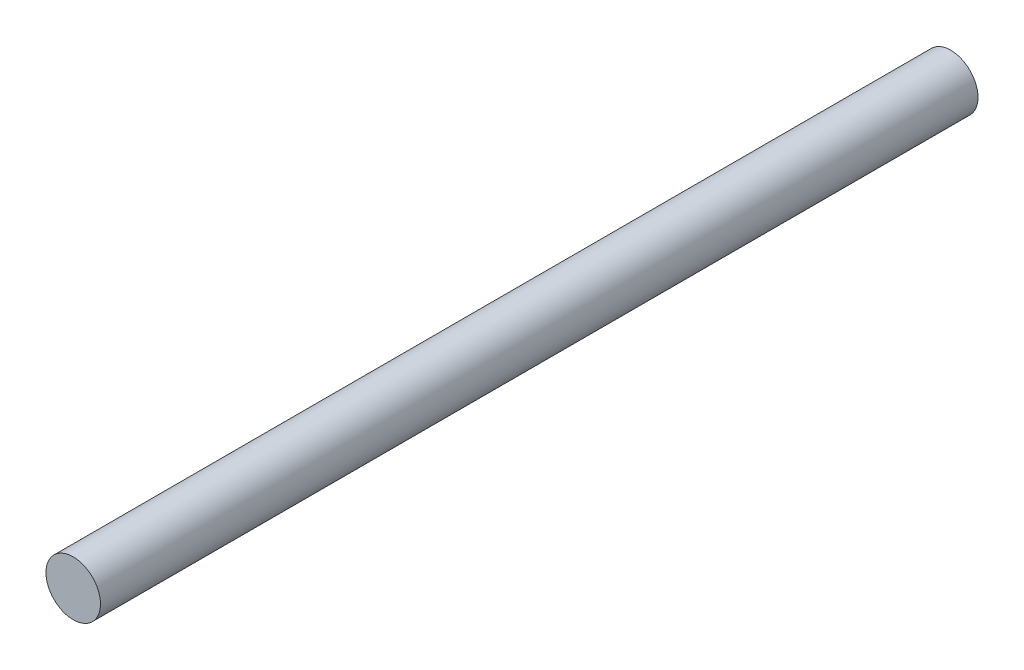
ISO-10303-21;
HEADER;
FILE_DESCRIPTION(('STEP AP214'),'2;1');
FILE_NAME('part.step','',(''),(''),'','','');
FILE_SCHEMA(('AUTOMOTIVE_DESIGN { 1 0 10303 214 1 1 1 1 }'));
ENDSEC;
DATA;
#1=APPLICATION_CONTEXT('core data for automotive mechanical design processes');
#2=APPLICATION_PROTOCOL_DEFINITION('international standard','automotive_design',2000,#1);
#3=PRODUCT_CONTEXT('',#1,'mechanical');
#4=PRODUCT('Part','Part','',(#3));
#5=PRODUCT_RELATED_PRODUCT_CATEGORY('part','',(#4));
#6=PRODUCT_DEFINITION_FORMATION('','',#4);
#7=PRODUCT_DEFINITION_CONTEXT('part definition',#1,'design');
#8=PRODUCT_DEFINITION('design','',#6,#7);
#9=PRODUCT_DEFINITION_SHAPE('','',#8);
#10=(LENGTH_UNIT() NAMED_UNIT(*) SI_UNIT(.MILLI.,.METRE.));
#11=(NAMED_UNIT(*) PLANE_ANGLE_UNIT() SI_UNIT($,.RADIAN.));
#12=(NAMED_UNIT(*) SI_UNIT($,.STERADIAN.) SOLID_ANGLE_UNIT());
#13=UNCERTAINTY_MEASURE_WITH_UNIT(LENGTH_MEASURE(1.E-05),#10,'distance_accuracy_value','');
#14=(GEOMETRIC_REPRESENTATION_CONTEXT(3) GLOBAL_UNCERTAINTY_ASSIGNED_CONTEXT((#13)) GLOBAL_UNIT_ASSIGNED_CONTEXT((#10,
#11,#12)) REPRESENTATION_CONTEXT('',''));
#15=CARTESIAN_POINT('',(0.,0.,0.));
#16=DIRECTION('',(0.,0.,1.));
#17=DIRECTION('',(1.,0.,0.));
#18=AXIS2_PLACEMENT_3D('',#15,#16,#17);
#19=CARTESIAN_POINT('',(0.,0.,95.));
#20=DIRECTION('',(0.,0.,-1.));
#21=DIRECTION('',(-1.,0.,0.));
#22=AXIS2_PLACEMENT_3D('',#19,#20,#21);
#23=CYLINDRICAL_SURFACE('',#22,2.95);
#24=CARTESIAN_POINT('',(0.,0.,95.));
#25=DIRECTION('',(0.,0.,1.));
#26=DIRECTION('',(1.,0.,0.));
#27=AXIS2_PLACEMENT_3D('',#24,#25,#26);
#28=CIRCLE('',#27,2.95);
#29=CARTESIAN_POINT('',(2.95,0.,95.));
#30=VERTEX_POINT('',#29);
#31=EDGE_CURVE('E10',#30,#30,#28,.T.);
#32=ORIENTED_EDGE('',*,*,#31,.F.);
#33=EDGE_LOOP('',(#32));
#34=FACE_BOUND('',#33,.T.);
#35=CARTESIAN_POINT('',(0.,0.,0.));
#36=DIRECTION('',(0.,0.,1.));
#37=DIRECTION('',(1.,0.,0.));
#38=AXIS2_PLACEMENT_3D('',#35,#36,#37);
#39=CIRCLE('',#38,2.95);
#40=CARTESIAN_POINT('',(2.95,0.,0.));
#41=VERTEX_POINT('',#40);
#42=EDGE_CURVE('E34',#41,#41,#39,.T.);
#43=ORIENTED_EDGE('',*,*,#42,.T.);
#44=EDGE_LOOP('',(#43));
#45=FACE_BOUND('',#44,.T.);
#46=ADVANCED_FACE('F31',(#34,#45),#23,.T.);
#47=CARTESIAN_POINT('',(0.,0.,95.));
#48=DIRECTION('',(0.,0.,1.));
#49=DIRECTION('',(1.,0.,0.));
#50=AXIS2_PLACEMENT_3D('',#47,#48,#49);
#51=PLANE('',#50);
#52=ORIENTED_EDGE('',*,*,#31,.T.);
#53=EDGE_LOOP('',(#52));
#54=FACE_BOUND('',#53,.T.);
#55=ADVANCED_FACE('F46',(#54),#51,.T.);
#56=CARTESIAN_POINT('',(0.,0.,0.));
#57=DIRECTION('',(0.,0.,1.));
#58=DIRECTION('',(1.,0.,0.));
#59=AXIS2_PLACEMENT_3D('',#56,#57,#58);
#60=PLANE('',#59);
#61=ORIENTED_EDGE('',*,*,#42,.F.);
#62=EDGE_LOOP('',(#61));
#63=FACE_BOUND('',#62,.T.);
#64=ADVANCED_FACE('F44',(#63),#60,.F.);
#65=CLOSED_SHELL('',(#46,#55,#64));
#66=MANIFOLD_SOLID_BREP('B2',#65);
#67=ADVANCED_BREP_SHAPE_REPRESENTATION('',(#18,#66),#14);
#68=SHAPE_DEFINITION_REPRESENTATION(#9,#67);
ENDSEC;
END-ISO-10303-21;
